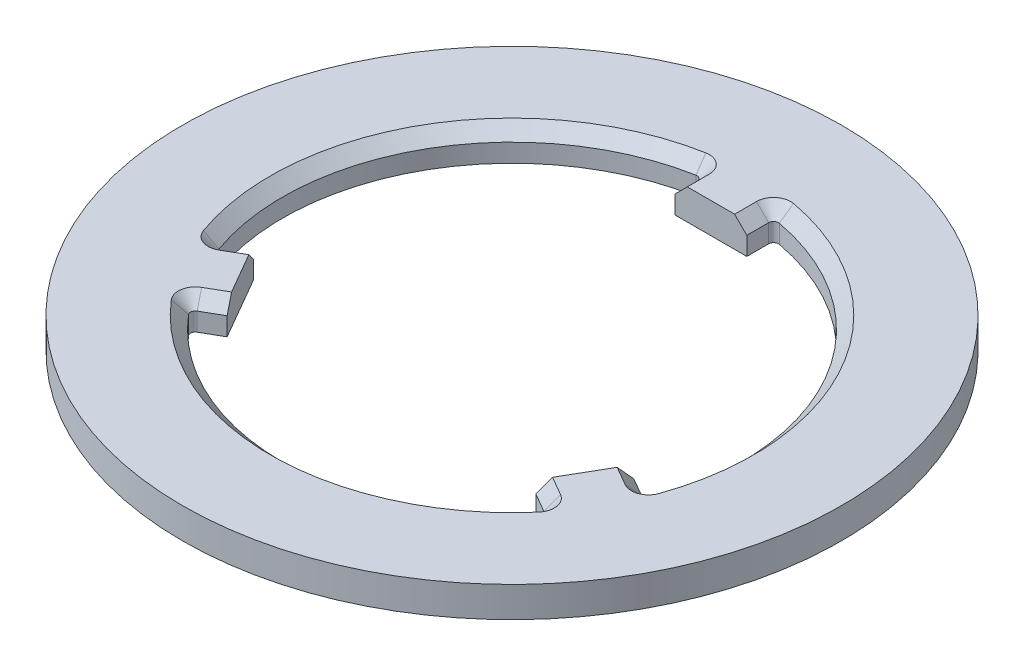
ISO-10303-21;
HEADER;
FILE_DESCRIPTION(('STEP AP214'),'2;1');
FILE_NAME('part.step','',(''),(''),'','','');
FILE_SCHEMA(('AUTOMOTIVE_DESIGN { 1 0 10303 214 1 1 1 1 }'));
ENDSEC;
DATA;
#1=APPLICATION_CONTEXT('core data for automotive mechanical design processes');
#2=APPLICATION_PROTOCOL_DEFINITION('international standard','automotive_design',2000,#1);
#3=PRODUCT_CONTEXT('',#1,'mechanical');
#4=PRODUCT('Part','Part','',(#3));
#5=PRODUCT_RELATED_PRODUCT_CATEGORY('part','',(#4));
#6=PRODUCT_DEFINITION_FORMATION('','',#4);
#7=PRODUCT_DEFINITION_CONTEXT('part definition',#1,'design');
#8=PRODUCT_DEFINITION('design','',#6,#7);
#9=PRODUCT_DEFINITION_SHAPE('','',#8);
#10=(LENGTH_UNIT() NAMED_UNIT(*) SI_UNIT(.MILLI.,.METRE.));
#11=(NAMED_UNIT(*) PLANE_ANGLE_UNIT() SI_UNIT($,.RADIAN.));
#12=(NAMED_UNIT(*) SI_UNIT($,.STERADIAN.) SOLID_ANGLE_UNIT());
#13=UNCERTAINTY_MEASURE_WITH_UNIT(LENGTH_MEASURE(1.E-05),#10,'distance_accuracy_value','');
#14=(GEOMETRIC_REPRESENTATION_CONTEXT(3) GLOBAL_UNCERTAINTY_ASSIGNED_CONTEXT((#13)) GLOBAL_UNIT_ASSIGNED_CONTEXT((#10,
#11,#12)) REPRESENTATION_CONTEXT('',''));
#15=CARTESIAN_POINT('',(0.,0.,0.));
#16=DIRECTION('',(0.,0.,1.));
#17=DIRECTION('',(1.,0.,0.));
#18=AXIS2_PLACEMENT_3D('',#15,#16,#17);
#19=CARTESIAN_POINT('',(0.,2.5,0.));
#20=DIRECTION('',(0.,-1.,0.));
#21=DIRECTION('',(0.,0.,-1.));
#22=AXIS2_PLACEMENT_3D('',#19,#20,#21);
#23=CYLINDRICAL_SURFACE('',#22,37.6);
#24=DIRECTION('',(0.,-1.,0.));
#25=VECTOR('',#24,1.);
#26=CARTESIAN_POINT('',(-28.6123532448992,2.5,24.3945330307654));
#27=LINE('',#26,#25);
#28=CARTESIAN_POINT('',(-28.6123532448992,-2.5,24.3945330307654));
#29=VERTEX_POINT('',#28);
#30=CARTESIAN_POINT('',(-28.6123532448992,0.499999999999984,24.3945330307654));
#31=VERTEX_POINT('',#30);
#32=EDGE_CURVE('E327',#29,#31,#27,.F.);
#33=ORIENTED_EDGE('',*,*,#32,.T.);
#34=CARTESIAN_POINT('',(0.,0.499999999999984,0.));
#35=DIRECTION('',(0.,1.,0.));
#36=DIRECTION('',(0.,0.,1.));
#37=AXIS2_PLACEMENT_3D('',#34,#35,#36);
#38=CIRCLE('',#37,37.6);
#39=CARTESIAN_POINT('',(28.6123532448989,0.499999999999984,24.3945330307658));
#40=VERTEX_POINT('',#39);
#41=EDGE_CURVE('E382',#31,#40,#38,.T.);
#42=ORIENTED_EDGE('',*,*,#41,.T.);
#43=DIRECTION('',(0.,-1.,0.));
#44=VECTOR('',#43,1.);
#45=CARTESIAN_POINT('',(28.6123532448989,2.5,24.3945330307658));
#46=LINE('',#45,#44);
#47=CARTESIAN_POINT('',(28.6123532448989,-2.5,24.3945330307658));
#48=VERTEX_POINT('',#47);
#49=EDGE_CURVE('E308',#40,#48,#46,.T.);
#50=ORIENTED_EDGE('',*,*,#49,.T.);
#51=CARTESIAN_POINT('',(0.,-2.5,0.));
#52=DIRECTION('',(0.,1.,0.));
#53=DIRECTION('',(0.,0.,1.));
#54=AXIS2_PLACEMENT_3D('',#51,#52,#53);
#55=CIRCLE('',#54,37.6);
#56=EDGE_CURVE('E288',#29,#48,#55,.T.);
#57=ORIENTED_EDGE('',*,*,#56,.F.);
#58=EDGE_LOOP('',(#33,#42,#50,#57));
#59=FACE_BOUND('',#58,.T.);
#60=ADVANCED_FACE('F37',(#59),#23,.F.);
#61=DIRECTION('',(0.,-1.,0.));
#62=VECTOR('',#61,1.);
#63=CARTESIAN_POINT('',(-6.82010869565217,2.5,-36.9762912875195));
#64=LINE('',#63,#62);
#65=CARTESIAN_POINT('',(-6.82010869565217,-2.5,-36.9762912875195));
#66=VERTEX_POINT('',#65);
#67=CARTESIAN_POINT('',(-6.82010869565217,0.500000000000047,-36.9762912875195));
#68=VERTEX_POINT('',#67);
#69=EDGE_CURVE('E292',#66,#68,#64,.F.);
#70=ORIENTED_EDGE('',*,*,#69,.T.);
#71=CARTESIAN_POINT('',(0.,0.500000000000047,0.));
#72=DIRECTION('',(0.,1.,0.));
#73=DIRECTION('',(0.,0.,1.));
#74=AXIS2_PLACEMENT_3D('',#71,#72,#73);
#75=CIRCLE('',#74,37.6);
#76=CARTESIAN_POINT('',(-35.4324619405513,0.500000000000047,12.5817582567535));
#77=VERTEX_POINT('',#76);
#78=EDGE_CURVE('E396',#68,#77,#75,.T.);
#79=ORIENTED_EDGE('',*,*,#78,.T.);
#80=DIRECTION('',(0.,-1.,0.));
#81=VECTOR('',#80,1.);
#82=CARTESIAN_POINT('',(-35.4324619405513,2.5,12.5817582567535));
#83=LINE('',#82,#81);
#84=CARTESIAN_POINT('',(-35.4324619405513,-2.5,12.5817582567535));
#85=VERTEX_POINT('',#84);
#86=EDGE_CURVE('E321',#77,#85,#83,.T.);
#87=ORIENTED_EDGE('',*,*,#86,.T.);
#88=EDGE_CURVE('E284',#66,#85,#55,.T.);
#89=ORIENTED_EDGE('',*,*,#88,.F.);
#90=EDGE_LOOP('',(#70,#79,#87,#89));
#91=FACE_BOUND('',#90,.T.);
#92=ADVANCED_FACE('F529',(#91),#23,.F.);
#93=DIRECTION('',(0.,-1.,0.));
#94=VECTOR('',#93,1.);
#95=CARTESIAN_POINT('',(35.4324619405511,2.5,12.581758256754));
#96=LINE('',#95,#94);
#97=CARTESIAN_POINT('',(35.4324619405511,-2.5,12.581758256754));
#98=VERTEX_POINT('',#97);
#99=CARTESIAN_POINT('',(35.4324619405511,0.50000000000004,12.581758256754));
#100=VERTEX_POINT('',#99);
#101=EDGE_CURVE('E315',#98,#100,#96,.F.);
#102=ORIENTED_EDGE('',*,*,#101,.T.);
#103=CARTESIAN_POINT('',(0.,0.50000000000004,0.));
#104=DIRECTION('',(0.,1.,0.));
#105=DIRECTION('',(0.,0.,1.));
#106=AXIS2_PLACEMENT_3D('',#103,#104,#105);
#107=CIRCLE('',#106,37.6);
#108=CARTESIAN_POINT('',(6.82010869565217,0.50000000000004,-36.9762912875195));
#109=VERTEX_POINT('',#108);
#110=EDGE_CURVE('E11',#100,#109,#107,.T.);
#111=ORIENTED_EDGE('',*,*,#110,.T.);
#112=DIRECTION('',(0.,-1.,0.));
#113=VECTOR('',#112,1.);
#114=CARTESIAN_POINT('',(6.82010869565217,2.5,-36.9762912875195));
#115=LINE('',#114,#113);
#116=CARTESIAN_POINT('',(6.82010869565217,-2.5,-36.9762912875195));
#117=VERTEX_POINT('',#116);
#118=EDGE_CURVE('E297',#109,#117,#115,.T.);
#119=ORIENTED_EDGE('',*,*,#118,.T.);
#120=EDGE_CURVE('E283',#98,#117,#55,.T.);
#121=ORIENTED_EDGE('',*,*,#120,.F.);
#122=EDGE_LOOP('',(#102,#111,#119,#121));
#123=FACE_BOUND('',#122,.T.);
#124=ADVANCED_FACE('F462',(#123),#23,.F.);
#125=CARTESIAN_POINT('',(0.,2.5,0.));
#126=DIRECTION('',(0.,1.,0.));
#127=DIRECTION('',(0.,0.,1.));
#128=AXIS2_PLACEMENT_3D('',#125,#126,#127);
#129=PLANE('',#128);
#130=CARTESIAN_POINT('',(0.,2.5,0.));
#131=DIRECTION('',(0.,1.,0.));
#132=DIRECTION('',(0.,0.,1.));
#133=AXIS2_PLACEMENT_3D('',#130,#131,#132);
#134=CIRCLE('',#133,54.);
#135=CARTESIAN_POINT('',(0.,2.5,54.));
#136=VERTEX_POINT('',#135);
#137=EDGE_CURVE('E289',#136,#136,#134,.T.);
#138=ORIENTED_EDGE('',*,*,#137,.T.);
#139=EDGE_LOOP('',(#138));
#140=FACE_BOUND('',#139,.T.);
#141=CARTESIAN_POINT('',(-28.0035797716035,2.5,23.8755004130896));
#142=DIRECTION('',(0.,1.,0.));
#143=DIRECTION('',(0.,0.,1.));
#144=AXIS2_PLACEMENT_3D('',#141,#142,#143);
#145=CIRCLE('',#144,2.80000000000002);
#146=CARTESIAN_POINT('',(-30.1342869281386,2.5,25.6921145749551));
#147=VERTEX_POINT('',#146);
#148=CARTESIAN_POINT('',(-29.4035797716035,2.5,21.4506292824931));
#149=VERTEX_POINT('',#148);
#150=EDGE_CURVE('E360',#147,#149,#145,.F.);
#151=ORIENTED_EDGE('',*,*,#150,.T.);
#152=DIRECTION('',(0.866025403784443,0.,-0.499999999999992));
#153=VECTOR('',#152,1.);
#154=CARTESIAN_POINT('',(-26.2949281633729,2.5,19.6558484396644));
#155=LINE('',#154,#153);
#156=CARTESIAN_POINT('',(-26.2949281633729,2.5,19.6558484396644));
#157=VERTEX_POINT('',#156);
#158=EDGE_CURVE('E364',#149,#157,#155,.T.);
#159=ORIENTED_EDGE('',*,*,#158,.T.);
#160=DIRECTION('',(-0.499999999999992,0.,-0.866025403784443));
#161=VECTOR('',#160,1.);
#162=CARTESIAN_POINT('',(-25.2949281633729,2.5,21.3878992472333));
#163=LINE('',#162,#161);
#164=CARTESIAN_POINT('',(-30.1699281633728,2.5,12.944151560335));
#165=VERTEX_POINT('',#164);
#166=EDGE_CURVE('E247',#157,#165,#163,.T.);
#167=ORIENTED_EDGE('',*,*,#166,.T.);
#168=DIRECTION('',(-0.866025403784443,0.,0.499999999999992));
#169=VECTOR('',#168,1.);
#170=CARTESIAN_POINT('',(-33.2785797716034,2.5,14.7389324031636));
#171=LINE('',#170,#169);
#172=CARTESIAN_POINT('',(-33.2785797716034,2.5,14.7389324031636));
#173=VERTEX_POINT('',#172);
#174=EDGE_CURVE('E351',#165,#173,#171,.T.);
#175=ORIENTED_EDGE('',*,*,#174,.T.);
#176=CARTESIAN_POINT('',(-34.6785797716034,2.5,12.3140612725672));
#177=DIRECTION('',(0.,1.,0.));
#178=DIRECTION('',(0.,0.,1.));
#179=AXIS2_PLACEMENT_3D('',#176,#177,#178);
#180=CIRCLE('',#179,2.79999999999996);
#181=CARTESIAN_POINT('',(-37.317167362921,2.5,13.2510007172191));
#182=VERTEX_POINT('',#181);
#183=EDGE_CURVE('E347',#173,#182,#180,.F.);
#184=ORIENTED_EDGE('',*,*,#183,.T.);
#185=CARTESIAN_POINT('',(0.,2.5,0.));
#186=DIRECTION('',(0.,1.,0.));
#187=DIRECTION('',(0.,0.,1.));
#188=AXIS2_PLACEMENT_3D('',#185,#186,#187);
#189=CIRCLE('',#188,39.6);
#190=CARTESIAN_POINT('',(-7.1828804347826,2.5,-38.9431152921747));
#191=VERTEX_POINT('',#190);
#192=EDGE_CURVE('E345',#182,#191,#189,.F.);
#193=ORIENTED_EDGE('',*,*,#192,.T.);
#194=CARTESIAN_POINT('',(-6.675,2.5,-36.1895616856574));
#195=DIRECTION('',(0.,1.,0.));
#196=DIRECTION('',(0.,0.,1.));
#197=AXIS2_PLACEMENT_3D('',#194,#195,#196);
#198=CIRCLE('',#197,2.79999999999996);
#199=CARTESIAN_POINT('',(-3.87500000000004,2.5,-36.1895616856574));
#200=VERTEX_POINT('',#199);
#201=EDGE_CURVE('E349',#191,#200,#198,.F.);
#202=ORIENTED_EDGE('',*,*,#201,.T.);
#203=DIRECTION('',(0.,0.,1.));
#204=VECTOR('',#203,1.);
#205=CARTESIAN_POINT('',(-3.87500000000004,2.5,-32.6));
#206=LINE('',#205,#204);
#207=CARTESIAN_POINT('',(-3.87500000000004,2.5,-32.6));
#208=VERTEX_POINT('',#207);
#209=EDGE_CURVE('E353',#200,#208,#206,.T.);
#210=ORIENTED_EDGE('',*,*,#209,.T.);
#211=DIRECTION('',(1.,0.,0.));
#212=VECTOR('',#211,1.);
#213=CARTESIAN_POINT('',(-5.875,2.5,-32.6));
#214=LINE('',#213,#212);
#215=CARTESIAN_POINT('',(3.87500000000003,2.5,-32.6));
#216=VERTEX_POINT('',#215);
#217=EDGE_CURVE('E268',#208,#216,#214,.T.);
#218=ORIENTED_EDGE('',*,*,#217,.T.);
#219=DIRECTION('',(0.,0.,-1.));
#220=VECTOR('',#219,1.);
#221=CARTESIAN_POINT('',(3.87500000000003,2.5,-36.1895616856574));
#222=LINE('',#221,#220);
#223=CARTESIAN_POINT('',(3.87500000000003,2.5,-36.1895616856574));
#224=VERTEX_POINT('',#223);
#225=EDGE_CURVE('E340',#216,#224,#222,.T.);
#226=ORIENTED_EDGE('',*,*,#225,.T.);
#227=CARTESIAN_POINT('',(6.675,2.5,-36.1895616856574));
#228=DIRECTION('',(0.,1.,0.));
#229=DIRECTION('',(0.,0.,1.));
#230=AXIS2_PLACEMENT_3D('',#227,#228,#229);
#231=CIRCLE('',#230,2.79999999999997);
#232=CARTESIAN_POINT('',(7.1828804347826,2.5,-38.9431152921748));
#233=VERTEX_POINT('',#232);
#234=EDGE_CURVE('E336',#224,#233,#231,.F.);
#235=ORIENTED_EDGE('',*,*,#234,.T.);
#236=CARTESIAN_POINT('',(0.,2.5,0.));
#237=DIRECTION('',(0.,1.,0.));
#238=DIRECTION('',(0.,0.,1.));
#239=AXIS2_PLACEMENT_3D('',#236,#237,#238);
#240=CIRCLE('',#239,39.6);
#241=CARTESIAN_POINT('',(37.3171673629208,2.5,13.2510007172196));
#242=VERTEX_POINT('',#241);
#243=EDGE_CURVE('E334',#233,#242,#240,.F.);
#244=ORIENTED_EDGE('',*,*,#243,.T.);
#245=CARTESIAN_POINT('',(34.6785797716032,2.5,12.3140612725677));
#246=DIRECTION('',(0.,1.,0.));
#247=DIRECTION('',(0.,0.,1.));
#248=AXIS2_PLACEMENT_3D('',#245,#246,#247);
#249=CIRCLE('',#248,2.79999999999997);
#250=CARTESIAN_POINT('',(33.2785797716032,2.5,14.7389324031641));
#251=VERTEX_POINT('',#250);
#252=EDGE_CURVE('E338',#242,#251,#249,.F.);
#253=ORIENTED_EDGE('',*,*,#252,.T.);
#254=DIRECTION('',(-0.866025403784436,0.,-0.500000000000004));
#255=VECTOR('',#254,1.);
#256=CARTESIAN_POINT('',(30.1699281633726,2.5,12.9441515603354));
#257=LINE('',#256,#255);
#258=CARTESIAN_POINT('',(30.1699281633726,2.5,12.9441515603354));
#259=VERTEX_POINT('',#258);
#260=EDGE_CURVE('E342',#251,#259,#257,.T.);
#261=ORIENTED_EDGE('',*,*,#260,.T.);
#262=DIRECTION('',(-0.500000000000004,0.,0.866025403784436));
#263=VECTOR('',#262,1.);
#264=CARTESIAN_POINT('',(31.1699281633726,2.5,11.2121007527666));
#265=LINE('',#264,#263);
#266=CARTESIAN_POINT('',(26.2949281633726,2.5,19.6558484396648));
#267=VERTEX_POINT('',#266);
#268=EDGE_CURVE('E252',#259,#267,#265,.T.);
#269=ORIENTED_EDGE('',*,*,#268,.T.);
#270=DIRECTION('',(0.866025403784437,0.,0.500000000000004));
#271=VECTOR('',#270,1.);
#272=CARTESIAN_POINT('',(29.4035797716032,2.5,21.4506292824935));
#273=LINE('',#272,#271);
#274=CARTESIAN_POINT('',(29.4035797716032,2.5,21.4506292824935));
#275=VERTEX_POINT('',#274);
#276=EDGE_CURVE('E362',#267,#275,#273,.T.);
#277=ORIENTED_EDGE('',*,*,#276,.T.);
#278=CARTESIAN_POINT('',(28.0035797716032,2.5,23.8755004130899));
#279=DIRECTION('',(0.,1.,0.));
#280=DIRECTION('',(0.,0.,1.));
#281=AXIS2_PLACEMENT_3D('',#278,#279,#280);
#282=CIRCLE('',#281,2.80000000000002);
#283=CARTESIAN_POINT('',(30.1342869281382,2.5,25.6921145749555));
#284=VERTEX_POINT('',#283);
#285=EDGE_CURVE('E358',#275,#284,#282,.F.);
#286=ORIENTED_EDGE('',*,*,#285,.T.);
#287=CARTESIAN_POINT('',(0.,2.5,0.));
#288=DIRECTION('',(0.,1.,0.));
#289=DIRECTION('',(0.,0.,1.));
#290=AXIS2_PLACEMENT_3D('',#287,#288,#289);
#291=CIRCLE('',#290,39.6);
#292=EDGE_CURVE('E356',#284,#147,#291,.F.);
#293=ORIENTED_EDGE('',*,*,#292,.T.);
#294=EDGE_LOOP('',(#151,#159,#167,#175,#184,#193,#202,#210,#218,#226,#235,#244,#253,#261,#269,
#277,#286,#293));
#295=FACE_BOUND('',#294,.T.);
#296=ADVANCED_FACE('F491',(#140,#295),#129,.T.);
#297=CARTESIAN_POINT('',(0.,-2.5,0.));
#298=DIRECTION('',(0.,1.,0.));
#299=DIRECTION('',(0.,0.,1.));
#300=AXIS2_PLACEMENT_3D('',#297,#298,#299);
#301=PLANE('',#300);
#302=CARTESIAN_POINT('',(0.,-2.5,0.));
#303=DIRECTION('',(0.,1.,0.));
#304=DIRECTION('',(0.,0.,1.));
#305=AXIS2_PLACEMENT_3D('',#302,#303,#304);
#306=CIRCLE('',#305,54.);
#307=CARTESIAN_POINT('',(0.,-2.5,54.));
#308=VERTEX_POINT('',#307);
#309=EDGE_CURVE('E287',#308,#308,#306,.T.);
#310=ORIENTED_EDGE('',*,*,#309,.F.);
#311=EDGE_LOOP('',(#310));
#312=FACE_BOUND('',#311,.T.);
#313=DIRECTION('',(0.,0.,1.));
#314=VECTOR('',#313,1.);
#315=CARTESIAN_POINT('',(-5.875,-2.5,-32.6));
#316=LINE('',#315,#314);
#317=CARTESIAN_POINT('',(-5.875,-2.5,-36.1895616856574));
#318=VERTEX_POINT('',#317);
#319=CARTESIAN_POINT('',(-5.875,-2.5,-32.6));
#320=VERTEX_POINT('',#319);
#321=EDGE_CURVE('E267',#318,#320,#316,.T.);
#322=ORIENTED_EDGE('',*,*,#321,.F.);
#323=CARTESIAN_POINT('',(-6.675,-2.5,-36.1895616856574));
#324=DIRECTION('',(0.,1.,0.));
#325=DIRECTION('',(0.,0.,1.));
#326=AXIS2_PLACEMENT_3D('',#323,#324,#325);
#327=CIRCLE('',#326,0.8);
#328=EDGE_CURVE('E306',#318,#66,#327,.T.);
#329=ORIENTED_EDGE('',*,*,#328,.T.);
#330=ORIENTED_EDGE('',*,*,#88,.T.);
#331=CARTESIAN_POINT('',(-34.6785797716034,-2.5,12.3140612725672));
#332=DIRECTION('',(0.,1.,0.));
#333=DIRECTION('',(0.,0.,1.));
#334=AXIS2_PLACEMENT_3D('',#331,#332,#333);
#335=CIRCLE('',#334,0.8);
#336=CARTESIAN_POINT('',(-34.2785797716034,-2.5,13.0068815955948));
#337=VERTEX_POINT('',#336);
#338=EDGE_CURVE('E330',#85,#337,#335,.T.);
#339=ORIENTED_EDGE('',*,*,#338,.T.);
#340=DIRECTION('',(-0.866025403784443,0.,0.499999999999992));
#341=VECTOR('',#340,1.);
#342=CARTESIAN_POINT('',(-31.1699281633728,-2.5,11.2121007527661));
#343=LINE('',#342,#341);
#344=CARTESIAN_POINT('',(-31.1699281633728,-2.5,11.2121007527661));
#345=VERTEX_POINT('',#344);
#346=EDGE_CURVE('E245',#345,#337,#343,.T.);
#347=ORIENTED_EDGE('',*,*,#346,.F.);
#348=DIRECTION('',(-0.499999999999992,0.,-0.866025403784443));
#349=VECTOR('',#348,1.);
#350=CARTESIAN_POINT('',(-25.2949281633729,-2.5,21.3878992472333));
#351=LINE('',#350,#349);
#352=CARTESIAN_POINT('',(-25.2949281633729,-2.5,21.3878992472333));
#353=VERTEX_POINT('',#352);
#354=EDGE_CURVE('E225',#353,#345,#351,.T.);
#355=ORIENTED_EDGE('',*,*,#354,.F.);
#356=DIRECTION('',(0.866025403784443,0.,-0.499999999999992));
#357=VECTOR('',#356,1.);
#358=CARTESIAN_POINT('',(-25.2949281633729,-2.5,21.3878992472333));
#359=LINE('',#358,#357);
#360=CARTESIAN_POINT('',(-28.4035797716035,-2.5,23.182680090062));
#361=VERTEX_POINT('',#360);
#362=EDGE_CURVE('E234',#361,#353,#359,.T.);
#363=ORIENTED_EDGE('',*,*,#362,.F.);
#364=CARTESIAN_POINT('',(-28.0035797716035,-2.5,23.8755004130896));
#365=DIRECTION('',(0.,1.,0.));
#366=DIRECTION('',(0.,0.,1.));
#367=AXIS2_PLACEMENT_3D('',#364,#365,#366);
#368=CIRCLE('',#367,0.8);
#369=EDGE_CURVE('E332',#361,#29,#368,.T.);
#370=ORIENTED_EDGE('',*,*,#369,.T.);
#371=ORIENTED_EDGE('',*,*,#56,.T.);
#372=CARTESIAN_POINT('',(28.0035797716032,-2.5,23.8755004130899));
#373=DIRECTION('',(0.,1.,0.));
#374=DIRECTION('',(0.,0.,1.));
#375=AXIS2_PLACEMENT_3D('',#372,#373,#374);
#376=CIRCLE('',#375,0.8);
#377=CARTESIAN_POINT('',(28.4035797716032,-2.5,23.1826800900624));
#378=VERTEX_POINT('',#377);
#379=EDGE_CURVE('E317',#48,#378,#376,.T.);
#380=ORIENTED_EDGE('',*,*,#379,.T.);
#381=DIRECTION('',(0.866025403784436,0.,0.500000000000004));
#382=VECTOR('',#381,1.);
#383=CARTESIAN_POINT('',(25.2949281633726,-2.5,21.3878992472337));
#384=LINE('',#383,#382);
#385=CARTESIAN_POINT('',(25.2949281633726,-2.5,21.3878992472337));
#386=VERTEX_POINT('',#385);
#387=EDGE_CURVE('E256',#386,#378,#384,.T.);
#388=ORIENTED_EDGE('',*,*,#387,.F.);
#389=DIRECTION('',(-0.500000000000004,0.,0.866025403784436));
#390=VECTOR('',#389,1.);
#391=CARTESIAN_POINT('',(31.1699281633726,-2.5,11.2121007527666));
#392=LINE('',#391,#390);
#393=CARTESIAN_POINT('',(31.1699281633726,-2.5,11.2121007527666));
#394=VERTEX_POINT('',#393);
#395=EDGE_CURVE('E259',#394,#386,#392,.T.);
#396=ORIENTED_EDGE('',*,*,#395,.F.);
#397=DIRECTION('',(-0.866025403784436,0.,-0.500000000000004));
#398=VECTOR('',#397,1.);
#399=CARTESIAN_POINT('',(31.1699281633726,-2.5,11.2121007527666));
#400=LINE('',#399,#398);
#401=CARTESIAN_POINT('',(34.2785797716032,-2.5,13.0068815955953));
#402=VERTEX_POINT('',#401);
#403=EDGE_CURVE('E230',#402,#394,#400,.T.);
#404=ORIENTED_EDGE('',*,*,#403,.F.);
#405=CARTESIAN_POINT('',(34.6785797716032,-2.5,12.3140612725677));
#406=DIRECTION('',(0.,1.,0.));
#407=DIRECTION('',(0.,0.,1.));
#408=AXIS2_PLACEMENT_3D('',#405,#406,#407);
#409=CIRCLE('',#408,0.8);
#410=EDGE_CURVE('E319',#402,#98,#409,.T.);
#411=ORIENTED_EDGE('',*,*,#410,.T.);
#412=ORIENTED_EDGE('',*,*,#120,.T.);
#413=CARTESIAN_POINT('',(6.675,-2.5,-36.1895616856574));
#414=DIRECTION('',(0.,1.,0.));
#415=DIRECTION('',(0.,0.,1.));
#416=AXIS2_PLACEMENT_3D('',#413,#414,#415);
#417=CIRCLE('',#416,0.8);
#418=CARTESIAN_POINT('',(5.875,-2.5,-36.1895616856574));
#419=VERTEX_POINT('',#418);
#420=EDGE_CURVE('E304',#117,#419,#417,.T.);
#421=ORIENTED_EDGE('',*,*,#420,.T.);
#422=DIRECTION('',(0.,0.,-1.));
#423=VECTOR('',#422,1.);
#424=CARTESIAN_POINT('',(5.875,-2.5,-32.6));
#425=LINE('',#424,#423);
#426=CARTESIAN_POINT('',(5.875,-2.5,-32.6));
#427=VERTEX_POINT('',#426);
#428=EDGE_CURVE('E272',#427,#419,#425,.T.);
#429=ORIENTED_EDGE('',*,*,#428,.F.);
#430=DIRECTION('',(1.,0.,0.));
#431=VECTOR('',#430,1.);
#432=CARTESIAN_POINT('',(-5.875,-2.5,-32.6));
#433=LINE('',#432,#431);
#434=EDGE_CURVE('E275',#320,#427,#433,.T.);
#435=ORIENTED_EDGE('',*,*,#434,.F.);
#436=EDGE_LOOP('',(#322,#329,#330,#339,#347,#355,#363,#370,#371,#380,#388,#396,#404,#411,#412,
#421,#429,#435));
#437=FACE_BOUND('',#436,.T.);
#438=ADVANCED_FACE('F243',(#312,#437),#301,.F.);
#439=CARTESIAN_POINT('',(0.,2.5,0.));
#440=DIRECTION('',(0.,-1.,0.));
#441=DIRECTION('',(0.,0.,-1.));
#442=AXIS2_PLACEMENT_3D('',#439,#440,#441);
#443=CYLINDRICAL_SURFACE('',#442,54.);
#444=ORIENTED_EDGE('',*,*,#137,.F.);
#445=EDGE_LOOP('',(#444));
#446=FACE_BOUND('',#445,.T.);
#447=ORIENTED_EDGE('',*,*,#309,.T.);
#448=EDGE_LOOP('',(#447));
#449=FACE_BOUND('',#448,.T.);
#450=ADVANCED_FACE('F580',(#446,#449),#443,.T.);
#451=CARTESIAN_POINT('',(-5.875,2.5,-32.6));
#452=DIRECTION('',(1.,0.,0.));
#453=DIRECTION('',(0.,0.,-1.));
#454=AXIS2_PLACEMENT_3D('',#451,#452,#453);
#455=PLANE('',#454);
#456=DIRECTION('',(0.,-1.,0.));
#457=VECTOR('',#456,1.);
#458=CARTESIAN_POINT('',(-5.875,2.5,-32.6));
#459=LINE('',#458,#457);
#460=CARTESIAN_POINT('',(-5.875,0.500000000000047,-32.6));
#461=VERTEX_POINT('',#460);
#462=EDGE_CURVE('E281',#461,#320,#459,.T.);
#463=ORIENTED_EDGE('',*,*,#462,.F.);
#464=DIRECTION('',(0.,0.,-1.));
#465=VECTOR('',#464,1.);
#466=CARTESIAN_POINT('',(-5.875,0.500000000000047,-36.1895616856574));
#467=LINE('',#466,#465);
#468=CARTESIAN_POINT('',(-5.875,0.500000000000047,-36.1895616856574));
#469=VERTEX_POINT('',#468);
#470=EDGE_CURVE('E388',#461,#469,#467,.T.);
#471=ORIENTED_EDGE('',*,*,#470,.T.);
#472=DIRECTION('',(0.,-1.,0.));
#473=VECTOR('',#472,1.);
#474=CARTESIAN_POINT('',(-5.875,2.5,-36.1895616856574));
#475=LINE('',#474,#473);
#476=EDGE_CURVE('E302',#469,#318,#475,.T.);
#477=ORIENTED_EDGE('',*,*,#476,.T.);
#478=ORIENTED_EDGE('',*,*,#321,.T.);
#479=EDGE_LOOP('',(#463,#471,#477,#478));
#480=FACE_BOUND('',#479,.T.);
#481=ADVANCED_FACE('F513',(#480),#455,.F.);
#482=CARTESIAN_POINT('',(-5.875,2.5,-32.6));
#483=DIRECTION('',(0.,0.,-1.));
#484=DIRECTION('',(-1.,0.,0.));
#485=AXIS2_PLACEMENT_3D('',#482,#483,#484);
#486=PLANE('',#485);
#487=ORIENTED_EDGE('',*,*,#217,.F.);
#488=DIRECTION('',(-0.707106781186549,-0.707106781186547,0.));
#489=VECTOR('',#488,1.);
#490=CARTESIAN_POINT('',(-3.87500000000004,2.5,-32.6));
#491=LINE('',#490,#489);
#492=EDGE_CURVE('E386',#208,#461,#491,.T.);
#493=ORIENTED_EDGE('',*,*,#492,.T.);
#494=ORIENTED_EDGE('',*,*,#462,.T.);
#495=ORIENTED_EDGE('',*,*,#434,.T.);
#496=DIRECTION('',(0.,-1.,0.));
#497=VECTOR('',#496,1.);
#498=CARTESIAN_POINT('',(5.875,2.5,-32.6));
#499=LINE('',#498,#497);
#500=CARTESIAN_POINT('',(5.875,0.50000000000004,-32.6));
#501=VERTEX_POINT('',#500);
#502=EDGE_CURVE('E271',#501,#427,#499,.T.);
#503=ORIENTED_EDGE('',*,*,#502,.F.);
#504=DIRECTION('',(-0.707106781186549,0.707106781186546,0.));
#505=VECTOR('',#504,1.);
#506=CARTESIAN_POINT('',(3.87500000000003,2.5,-32.6));
#507=LINE('',#506,#505);
#508=EDGE_CURVE('E384',#501,#216,#507,.T.);
#509=ORIENTED_EDGE('',*,*,#508,.T.);
#510=EDGE_LOOP('',(#487,#493,#494,#495,#503,#509));
#511=FACE_BOUND('',#510,.T.);
#512=ADVANCED_FACE('F453',(#511),#486,.F.);
#513=CARTESIAN_POINT('',(5.875,2.5,-32.6));
#514=DIRECTION('',(-1.,0.,0.));
#515=DIRECTION('',(0.,0.,1.));
#516=AXIS2_PLACEMENT_3D('',#513,#514,#515);
#517=PLANE('',#516);
#518=DIRECTION('',(0.,-1.,0.));
#519=VECTOR('',#518,1.);
#520=CARTESIAN_POINT('',(5.875,2.5,-36.1895616856574));
#521=LINE('',#520,#519);
#522=CARTESIAN_POINT('',(5.875,0.50000000000004,-36.1895616856574));
#523=VERTEX_POINT('',#522);
#524=EDGE_CURVE('E299',#419,#523,#521,.F.);
#525=ORIENTED_EDGE('',*,*,#524,.T.);
#526=DIRECTION('',(0.,0.,1.));
#527=VECTOR('',#526,1.);
#528=CARTESIAN_POINT('',(5.875,0.50000000000004,-32.6));
#529=LINE('',#528,#527);
#530=EDGE_CURVE('E400',#523,#501,#529,.T.);
#531=ORIENTED_EDGE('',*,*,#530,.T.);
#532=ORIENTED_EDGE('',*,*,#502,.T.);
#533=ORIENTED_EDGE('',*,*,#428,.T.);
#534=EDGE_LOOP('',(#525,#531,#532,#533));
#535=FACE_BOUND('',#534,.T.);
#536=ADVANCED_FACE('F449',(#535),#517,.F.);
#537=CARTESIAN_POINT('',(6.675,2.5,-36.1895616856574));
#538=DIRECTION('',(0.,-1.,0.));
#539=DIRECTION('',(0.,0.,-1.));
#540=AXIS2_PLACEMENT_3D('',#537,#538,#539);
#541=CYLINDRICAL_SURFACE('',#540,0.8);
#542=ORIENTED_EDGE('',*,*,#118,.F.);
#543=CARTESIAN_POINT('',(6.675,0.50000000000004,-36.1895616856574));
#544=DIRECTION('',(0.,1.,0.));
#545=DIRECTION('',(0.,0.,1.));
#546=AXIS2_PLACEMENT_3D('',#543,#544,#545);
#547=CIRCLE('',#546,0.8);
#548=EDGE_CURVE('E47',#109,#523,#547,.T.);
#549=ORIENTED_EDGE('',*,*,#548,.T.);
#550=ORIENTED_EDGE('',*,*,#524,.F.);
#551=ORIENTED_EDGE('',*,*,#420,.F.);
#552=EDGE_LOOP('',(#542,#549,#550,#551));
#553=FACE_BOUND('',#552,.T.);
#554=ADVANCED_FACE('F460',(#553),#541,.F.);
#555=CARTESIAN_POINT('',(-6.675,2.5,-36.1895616856574));
#556=DIRECTION('',(0.,-1.,0.));
#557=DIRECTION('',(0.,0.,-1.));
#558=AXIS2_PLACEMENT_3D('',#555,#556,#557);
#559=CYLINDRICAL_SURFACE('',#558,0.8);
#560=ORIENTED_EDGE('',*,*,#476,.F.);
#561=CARTESIAN_POINT('',(-6.675,0.500000000000047,-36.1895616856574));
#562=DIRECTION('',(0.,1.,0.));
#563=DIRECTION('',(0.,0.,1.));
#564=AXIS2_PLACEMENT_3D('',#561,#562,#563);
#565=CIRCLE('',#564,0.8);
#566=EDGE_CURVE('E392',#469,#68,#565,.T.);
#567=ORIENTED_EDGE('',*,*,#566,.T.);
#568=ORIENTED_EDGE('',*,*,#69,.F.);
#569=ORIENTED_EDGE('',*,*,#328,.F.);
#570=EDGE_LOOP('',(#560,#567,#568,#569));
#571=FACE_BOUND('',#570,.T.);
#572=ADVANCED_FACE('F524',(#571),#559,.F.);
#573=CARTESIAN_POINT('',(31.1699281633726,2.5,11.2121007527666));
#574=DIRECTION('',(-0.500000000000004,0.,0.866025403784436));
#575=DIRECTION('',(0.866025403784436,0.,0.500000000000004));
#576=AXIS2_PLACEMENT_3D('',#573,#574,#575);
#577=PLANE('',#576);
#578=DIRECTION('',(0.,-1.,0.));
#579=VECTOR('',#578,1.);
#580=CARTESIAN_POINT('',(31.1699281633726,2.5,11.2121007527666));
#581=LINE('',#580,#579);
#582=CARTESIAN_POINT('',(31.1699281633726,0.500000000000036,11.2121007527666));
#583=VERTEX_POINT('',#582);
#584=EDGE_CURVE('E265',#583,#394,#581,.T.);
#585=ORIENTED_EDGE('',*,*,#584,.F.);
#586=DIRECTION('',(0.866025403784436,0.,0.500000000000004));
#587=VECTOR('',#586,1.);
#588=CARTESIAN_POINT('',(34.2785797716032,0.500000000000036,13.0068815955953));
#589=LINE('',#588,#587);
#590=CARTESIAN_POINT('',(34.2785797716032,0.50000000000004,13.0068815955953));
#591=VERTEX_POINT('',#590);
#592=EDGE_CURVE('E398',#583,#591,#589,.T.);
#593=ORIENTED_EDGE('',*,*,#592,.T.);
#594=DIRECTION('',(0.,-1.,0.));
#595=VECTOR('',#594,1.);
#596=CARTESIAN_POINT('',(34.2785797716032,2.5,13.0068815955953));
#597=LINE('',#596,#595);
#598=EDGE_CURVE('E313',#591,#402,#597,.T.);
#599=ORIENTED_EDGE('',*,*,#598,.T.);
#600=ORIENTED_EDGE('',*,*,#403,.T.);
#601=EDGE_LOOP('',(#585,#593,#599,#600));
#602=FACE_BOUND('',#601,.T.);
#603=ADVANCED_FACE('F500',(#602),#577,.F.);
#604=CARTESIAN_POINT('',(31.1699281633726,2.5,11.2121007527666));
#605=DIRECTION('',(0.866025403784436,0.,0.500000000000004));
#606=DIRECTION('',(0.500000000000004,0.,-0.866025403784436));
#607=AXIS2_PLACEMENT_3D('',#604,#605,#606);
#608=PLANE('',#607);
#609=DIRECTION('',(0.,-1.,0.));
#610=VECTOR('',#609,1.);
#611=CARTESIAN_POINT('',(25.2949281633726,2.5,21.3878992472337));
#612=LINE('',#611,#610);
#613=CARTESIAN_POINT('',(25.2949281633726,0.499999999999986,21.3878992472337));
#614=VERTEX_POINT('',#613);
#615=EDGE_CURVE('E255',#614,#386,#612,.T.);
#616=ORIENTED_EDGE('',*,*,#615,.F.);
#617=DIRECTION('',(0.353553390593277,0.707106781186547,-0.612372435695793));
#618=VECTOR('',#617,1.);
#619=CARTESIAN_POINT('',(26.2949281633726,2.5,19.6558484396648));
#620=LINE('',#619,#618);
#621=EDGE_CURVE('E376',#614,#267,#620,.T.);
#622=ORIENTED_EDGE('',*,*,#621,.T.);
#623=ORIENTED_EDGE('',*,*,#268,.F.);
#624=DIRECTION('',(0.353553390593278,-0.707106781186546,-0.612372435695795));
#625=VECTOR('',#624,1.);
#626=CARTESIAN_POINT('',(30.1699281633726,2.5,12.9441515603354));
#627=LINE('',#626,#625);
#628=EDGE_CURVE('E374',#259,#583,#627,.T.);
#629=ORIENTED_EDGE('',*,*,#628,.T.);
#630=ORIENTED_EDGE('',*,*,#584,.T.);
#631=ORIENTED_EDGE('',*,*,#395,.T.);
#632=EDGE_LOOP('',(#616,#622,#623,#629,#630,#631));
#633=FACE_BOUND('',#632,.T.);
#634=ADVANCED_FACE('F496',(#633),#608,.F.);
#635=CARTESIAN_POINT('',(25.2949281633726,2.5,21.3878992472337));
#636=DIRECTION('',(0.500000000000004,0.,-0.866025403784436));
#637=DIRECTION('',(-0.866025403784436,0.,-0.500000000000004));
#638=AXIS2_PLACEMENT_3D('',#635,#636,#637);
#639=PLANE('',#638);
#640=DIRECTION('',(0.,-1.,0.));
#641=VECTOR('',#640,1.);
#642=CARTESIAN_POINT('',(28.4035797716032,2.5,23.1826800900624));
#643=LINE('',#642,#641);
#644=CARTESIAN_POINT('',(28.4035797716032,0.499999999999985,23.1826800900624));
#645=VERTEX_POINT('',#644);
#646=EDGE_CURVE('E310',#378,#645,#643,.F.);
#647=ORIENTED_EDGE('',*,*,#646,.T.);
#648=DIRECTION('',(-0.866025403784436,0.,-0.500000000000004));
#649=VECTOR('',#648,1.);
#650=CARTESIAN_POINT('',(25.2949281633726,0.499999999999986,21.3878992472337));
#651=LINE('',#650,#649);
#652=EDGE_CURVE('E372',#645,#614,#651,.T.);
#653=ORIENTED_EDGE('',*,*,#652,.T.);
#654=ORIENTED_EDGE('',*,*,#615,.T.);
#655=ORIENTED_EDGE('',*,*,#387,.T.);
#656=EDGE_LOOP('',(#647,#653,#654,#655));
#657=FACE_BOUND('',#656,.T.);
#658=ADVANCED_FACE('F478',(#657),#639,.F.);
#659=CARTESIAN_POINT('',(-25.2949281633729,2.5,21.3878992472333));
#660=DIRECTION('',(-0.499999999999992,0.,-0.866025403784443));
#661=DIRECTION('',(-0.866025403784443,0.,0.499999999999992));
#662=AXIS2_PLACEMENT_3D('',#659,#660,#661);
#663=PLANE('',#662);
#664=DIRECTION('',(0.,-1.,0.));
#665=VECTOR('',#664,1.);
#666=CARTESIAN_POINT('',(-25.2949281633729,2.5,21.3878992472333));
#667=LINE('',#666,#665);
#668=CARTESIAN_POINT('',(-25.2949281633729,0.499999999999981,21.3878992472333));
#669=VERTEX_POINT('',#668);
#670=EDGE_CURVE('E219',#669,#353,#667,.T.);
#671=ORIENTED_EDGE('',*,*,#670,.F.);
#672=DIRECTION('',(-0.866025403784443,0.,0.499999999999992));
#673=VECTOR('',#672,1.);
#674=CARTESIAN_POINT('',(-28.4035797716035,0.499999999999981,23.182680090062));
#675=LINE('',#674,#673);
#676=CARTESIAN_POINT('',(-28.4035797716035,0.499999999999984,23.182680090062));
#677=VERTEX_POINT('',#676);
#678=EDGE_CURVE('E370',#669,#677,#675,.T.);
#679=ORIENTED_EDGE('',*,*,#678,.T.);
#680=DIRECTION('',(0.,-1.,0.));
#681=VECTOR('',#680,1.);
#682=CARTESIAN_POINT('',(-28.4035797716035,2.5,23.182680090062));
#683=LINE('',#682,#681);
#684=EDGE_CURVE('E237',#677,#361,#683,.T.);
#685=ORIENTED_EDGE('',*,*,#684,.T.);
#686=ORIENTED_EDGE('',*,*,#362,.T.);
#687=EDGE_LOOP('',(#671,#679,#685,#686));
#688=FACE_BOUND('',#687,.T.);
#689=ADVANCED_FACE('F235',(#688),#663,.F.);
#690=CARTESIAN_POINT('',(-25.2949281633729,2.5,21.3878992472333));
#691=DIRECTION('',(-0.866025403784443,0.,0.499999999999992));
#692=DIRECTION('',(0.499999999999992,0.,0.866025403784443));
#693=AXIS2_PLACEMENT_3D('',#690,#691,#692);
#694=PLANE('',#693);
#695=ORIENTED_EDGE('',*,*,#166,.F.);
#696=DIRECTION('',(0.353553390593268,-0.707106781186548,0.612372435695798));
#697=VECTOR('',#696,1.);
#698=CARTESIAN_POINT('',(-26.2949281633729,2.5,19.6558484396644));
#699=LINE('',#698,#697);
#700=EDGE_CURVE('E227',#157,#669,#699,.T.);
#701=ORIENTED_EDGE('',*,*,#700,.T.);
#702=ORIENTED_EDGE('',*,*,#670,.T.);
#703=ORIENTED_EDGE('',*,*,#354,.T.);
#704=DIRECTION('',(0.,-1.,0.));
#705=VECTOR('',#704,1.);
#706=CARTESIAN_POINT('',(-31.1699281633728,2.5,11.2121007527661));
#707=LINE('',#706,#705);
#708=CARTESIAN_POINT('',(-31.1699281633728,0.500000000000045,11.2121007527661));
#709=VERTEX_POINT('',#708);
#710=EDGE_CURVE('E231',#709,#345,#707,.T.);
#711=ORIENTED_EDGE('',*,*,#710,.F.);
#712=DIRECTION('',(0.353553390593269,0.707106781186547,0.612372435695799));
#713=VECTOR('',#712,1.);
#714=CARTESIAN_POINT('',(-30.1699281633728,2.49999999999999,12.944151560335));
#715=LINE('',#714,#713);
#716=EDGE_CURVE('E367',#709,#165,#715,.T.);
#717=ORIENTED_EDGE('',*,*,#716,.T.);
#718=EDGE_LOOP('',(#695,#701,#702,#703,#711,#717));
#719=FACE_BOUND('',#718,.T.);
#720=ADVANCED_FACE('F222',(#719),#694,.F.);
#721=CARTESIAN_POINT('',(-31.1699281633728,2.5,11.2121007527661));
#722=DIRECTION('',(0.499999999999992,0.,0.866025403784443));
#723=DIRECTION('',(0.866025403784443,0.,-0.499999999999992));
#724=AXIS2_PLACEMENT_3D('',#721,#722,#723);
#725=PLANE('',#724);
#726=DIRECTION('',(0.,-1.,0.));
#727=VECTOR('',#726,1.);
#728=CARTESIAN_POINT('',(-34.2785797716034,2.5,13.0068815955948));
#729=LINE('',#728,#727);
#730=CARTESIAN_POINT('',(-34.2785797716034,0.500000000000047,13.0068815955948));
#731=VERTEX_POINT('',#730);
#732=EDGE_CURVE('E323',#337,#731,#729,.F.);
#733=ORIENTED_EDGE('',*,*,#732,.T.);
#734=DIRECTION('',(0.866025403784443,0.,-0.499999999999992));
#735=VECTOR('',#734,1.);
#736=CARTESIAN_POINT('',(-31.1699281633728,0.500000000000045,11.2121007527661));
#737=LINE('',#736,#735);
#738=EDGE_CURVE('E390',#731,#709,#737,.T.);
#739=ORIENTED_EDGE('',*,*,#738,.T.);
#740=ORIENTED_EDGE('',*,*,#710,.T.);
#741=ORIENTED_EDGE('',*,*,#346,.T.);
#742=EDGE_LOOP('',(#733,#739,#740,#741));
#743=FACE_BOUND('',#742,.T.);
#744=ADVANCED_FACE('F546',(#743),#725,.F.);
#745=CARTESIAN_POINT('',(28.0035797716032,2.5,23.8755004130899));
#746=DIRECTION('',(0.,-1.,0.));
#747=DIRECTION('',(0.,0.,-1.));
#748=AXIS2_PLACEMENT_3D('',#745,#746,#747);
#749=CYLINDRICAL_SURFACE('',#748,0.8);
#750=ORIENTED_EDGE('',*,*,#49,.F.);
#751=CARTESIAN_POINT('',(28.0035797716032,0.499999999999985,23.8755004130899));
#752=DIRECTION('',(0.,1.,0.));
#753=DIRECTION('',(0.,0.,1.));
#754=AXIS2_PLACEMENT_3D('',#751,#752,#753);
#755=CIRCLE('',#754,0.8);
#756=EDGE_CURVE('E380',#40,#645,#755,.T.);
#757=ORIENTED_EDGE('',*,*,#756,.T.);
#758=ORIENTED_EDGE('',*,*,#646,.F.);
#759=ORIENTED_EDGE('',*,*,#379,.F.);
#760=EDGE_LOOP('',(#750,#757,#758,#759));
#761=FACE_BOUND('',#760,.T.);
#762=ADVANCED_FACE('F474',(#761),#749,.F.);
#763=CARTESIAN_POINT('',(34.6785797716032,2.5,12.3140612725677));
#764=DIRECTION('',(0.,-1.,0.));
#765=DIRECTION('',(0.,0.,-1.));
#766=AXIS2_PLACEMENT_3D('',#763,#764,#765);
#767=CYLINDRICAL_SURFACE('',#766,0.8);
#768=ORIENTED_EDGE('',*,*,#598,.F.);
#769=CARTESIAN_POINT('',(34.6785797716032,0.50000000000004,12.3140612725677));
#770=DIRECTION('',(0.,1.,0.));
#771=DIRECTION('',(0.,0.,1.));
#772=AXIS2_PLACEMENT_3D('',#769,#770,#771);
#773=CIRCLE('',#772,0.8);
#774=EDGE_CURVE('E61',#591,#100,#773,.T.);
#775=ORIENTED_EDGE('',*,*,#774,.T.);
#776=ORIENTED_EDGE('',*,*,#101,.F.);
#777=ORIENTED_EDGE('',*,*,#410,.F.);
#778=EDGE_LOOP('',(#768,#775,#776,#777));
#779=FACE_BOUND('',#778,.T.);
#780=ADVANCED_FACE('F502',(#779),#767,.F.);
#781=CARTESIAN_POINT('',(-34.6785797716034,2.5,12.3140612725672));
#782=DIRECTION('',(0.,-1.,0.));
#783=DIRECTION('',(0.,0.,-1.));
#784=AXIS2_PLACEMENT_3D('',#781,#782,#783);
#785=CYLINDRICAL_SURFACE('',#784,0.8);
#786=ORIENTED_EDGE('',*,*,#86,.F.);
#787=CARTESIAN_POINT('',(-34.6785797716034,0.500000000000047,12.3140612725672));
#788=DIRECTION('',(0.,1.,0.));
#789=DIRECTION('',(0.,0.,1.));
#790=AXIS2_PLACEMENT_3D('',#787,#788,#789);
#791=CIRCLE('',#790,0.8);
#792=EDGE_CURVE('E394',#77,#731,#791,.T.);
#793=ORIENTED_EDGE('',*,*,#792,.T.);
#794=ORIENTED_EDGE('',*,*,#732,.F.);
#795=ORIENTED_EDGE('',*,*,#338,.F.);
#796=EDGE_LOOP('',(#786,#793,#794,#795));
#797=FACE_BOUND('',#796,.T.);
#798=ADVANCED_FACE('F542',(#797),#785,.F.);
#799=CARTESIAN_POINT('',(-28.0035797716035,2.5,23.8755004130896));
#800=DIRECTION('',(0.,-1.,0.));
#801=DIRECTION('',(0.,0.,-1.));
#802=AXIS2_PLACEMENT_3D('',#799,#800,#801);
#803=CYLINDRICAL_SURFACE('',#802,0.8);
#804=ORIENTED_EDGE('',*,*,#684,.F.);
#805=CARTESIAN_POINT('',(-28.0035797716035,0.499999999999984,23.8755004130896));
#806=DIRECTION('',(0.,1.,0.));
#807=DIRECTION('',(0.,0.,1.));
#808=AXIS2_PLACEMENT_3D('',#805,#806,#807);
#809=CIRCLE('',#808,0.8);
#810=EDGE_CURVE('E378',#677,#31,#809,.T.);
#811=ORIENTED_EDGE('',*,*,#810,.T.);
#812=ORIENTED_EDGE('',*,*,#32,.F.);
#813=ORIENTED_EDGE('',*,*,#369,.F.);
#814=EDGE_LOOP('',(#804,#811,#812,#813));
#815=FACE_BOUND('',#814,.T.);
#816=ADVANCED_FACE('F559',(#815),#803,.F.);
#817=CARTESIAN_POINT('',(-1.93750000000001,2.5,3.35584843966468));
#818=DIRECTION('',(-0.353553390593276,0.707106781186548,0.612372435695792));
#819=DIRECTION('',(-0.866025403784436,0.,-0.500000000000004));
#820=AXIS2_PLACEMENT_3D('',#817,#818,#819);
#821=PLANE('',#820);
#822=ORIENTED_EDGE('',*,*,#621,.F.);
#823=ORIENTED_EDGE('',*,*,#652,.F.);
#824=DIRECTION('',(-0.353553390593277,-0.707106781186546,0.612372435695794));
#825=VECTOR('',#824,1.);
#826=CARTESIAN_POINT('',(29.4035797716032,2.5,21.4506292824935));
#827=LINE('',#826,#825);
#828=EDGE_CURVE('E240',#275,#645,#827,.T.);
#829=ORIENTED_EDGE('',*,*,#828,.F.);
#830=ORIENTED_EDGE('',*,*,#276,.F.);
#831=EDGE_LOOP('',(#822,#823,#829,#830));
#832=FACE_BOUND('',#831,.T.);
#833=ADVANCED_FACE('F483',(#832),#821,.T.);
#834=CARTESIAN_POINT('',(28.0035797716032,2.5,23.8755004130899));
#835=DIRECTION('',(0.,1.,0.));
#836=DIRECTION('',(0.,0.,1.));
#837=AXIS2_PLACEMENT_3D('',#834,#835,#836);
#838=CONICAL_SURFACE('',#837,2.80000000000002,0.78539816339745);
#839=ORIENTED_EDGE('',*,*,#828,.T.);
#840=ORIENTED_EDGE('',*,*,#756,.F.);
#841=DIRECTION('',(-0.538084813967367,-0.707106781186546,-0.458764354519514));
#842=VECTOR('',#841,1.);
#843=CARTESIAN_POINT('',(30.1342869281382,2.5,25.6921145749555));
#844=LINE('',#843,#842);
#845=EDGE_CURVE('E411',#284,#40,#844,.T.);
#846=ORIENTED_EDGE('',*,*,#845,.F.);
#847=ORIENTED_EDGE('',*,*,#285,.F.);
#848=EDGE_LOOP('',(#839,#840,#846,#847));
#849=FACE_BOUND('',#848,.T.);
#850=ADVANCED_FACE('F487',(#849),#838,.F.);
#851=CARTESIAN_POINT('',(0.,0.499999999999984,0.));
#852=DIRECTION('',(0.,1.,0.));
#853=DIRECTION('',(0.,0.,1.));
#854=AXIS2_PLACEMENT_3D('',#851,#852,#853);
#855=CONICAL_SURFACE('',#854,37.6,0.78539816339745);
#856=ORIENTED_EDGE('',*,*,#845,.T.);
#857=ORIENTED_EDGE('',*,*,#41,.F.);
#858=DIRECTION('',(0.538084813967374,-0.707106781186546,-0.458764354519506));
#859=VECTOR('',#858,1.);
#860=CARTESIAN_POINT('',(-30.1342869281386,2.5,25.6921145749551));
#861=LINE('',#860,#859);
#862=EDGE_CURVE('E407',#147,#31,#861,.T.);
#863=ORIENTED_EDGE('',*,*,#862,.F.);
#864=ORIENTED_EDGE('',*,*,#292,.F.);
#865=EDGE_LOOP('',(#856,#857,#863,#864));
#866=FACE_BOUND('',#865,.T.);
#867=ADVANCED_FACE('F564',(#866),#855,.F.);
#868=CARTESIAN_POINT('',(-28.0035797716035,2.5,23.8755004130896));
#869=DIRECTION('',(0.,1.,0.));
#870=DIRECTION('',(0.,0.,1.));
#871=AXIS2_PLACEMENT_3D('',#868,#869,#870);
#872=CONICAL_SURFACE('',#871,2.80000000000002,0.78539816339745);
#873=ORIENTED_EDGE('',*,*,#862,.T.);
#874=ORIENTED_EDGE('',*,*,#810,.F.);
#875=DIRECTION('',(0.353553390593268,-0.707106781186546,0.612372435695799));
#876=VECTOR('',#875,1.);
#877=CARTESIAN_POINT('',(-29.4035797716035,2.5,21.4506292824931));
#878=LINE('',#877,#876);
#879=EDGE_CURVE('E404',#149,#677,#878,.T.);
#880=ORIENTED_EDGE('',*,*,#879,.F.);
#881=ORIENTED_EDGE('',*,*,#150,.F.);
#882=EDGE_LOOP('',(#873,#874,#880,#881));
#883=FACE_BOUND('',#882,.T.);
#884=ADVANCED_FACE('F561',(#883),#872,.F.);
#885=CARTESIAN_POINT('',(1.93749999999996,2.5,3.35584843966471));
#886=DIRECTION('',(0.353553390593268,0.707106781186547,0.612372435695798));
#887=DIRECTION('',(-0.866025403784443,0.,0.499999999999992));
#888=AXIS2_PLACEMENT_3D('',#885,#886,#887);
#889=PLANE('',#888);
#890=ORIENTED_EDGE('',*,*,#879,.T.);
#891=ORIENTED_EDGE('',*,*,#678,.F.);
#892=ORIENTED_EDGE('',*,*,#700,.F.);
#893=ORIENTED_EDGE('',*,*,#158,.F.);
#894=EDGE_LOOP('',(#890,#891,#892,#893));
#895=FACE_BOUND('',#894,.T.);
#896=ADVANCED_FACE('F556',(#895),#889,.T.);
#897=CARTESIAN_POINT('',(-1.9375,2.5,-3.35584843966476));
#898=DIRECTION('',(-0.353553390593268,0.707106781186548,-0.612372435695797));
#899=DIRECTION('',(0.866025403784443,0.,-0.499999999999992));
#900=AXIS2_PLACEMENT_3D('',#897,#898,#899);
#901=PLANE('',#900);
#902=ORIENTED_EDGE('',*,*,#716,.F.);
#903=ORIENTED_EDGE('',*,*,#738,.F.);
#904=DIRECTION('',(-0.353553390593269,-0.707106781186547,-0.612372435695798));
#905=VECTOR('',#904,1.);
#906=CARTESIAN_POINT('',(-33.2785797716034,2.5,14.7389324031636));
#907=LINE('',#906,#905);
#908=EDGE_CURVE('E408',#173,#731,#907,.T.);
#909=ORIENTED_EDGE('',*,*,#908,.F.);
#910=ORIENTED_EDGE('',*,*,#174,.F.);
#911=EDGE_LOOP('',(#902,#903,#909,#910));
#912=FACE_BOUND('',#911,.T.);
#913=ADVANCED_FACE('F549',(#912),#901,.T.);
#914=CARTESIAN_POINT('',(-34.6785797716034,2.5,12.3140612725672));
#915=DIRECTION('',(0.,1.,0.));
#916=DIRECTION('',(0.,0.,1.));
#917=AXIS2_PLACEMENT_3D('',#914,#915,#916);
#918=CONICAL_SURFACE('',#917,2.79999999999996,0.78539816339745);
#919=ORIENTED_EDGE('',*,*,#908,.T.);
#920=ORIENTED_EDGE('',*,*,#792,.F.);
#921=DIRECTION('',(0.666343992348354,-0.707106781186547,-0.236612941026601));
#922=VECTOR('',#921,1.);
#923=CARTESIAN_POINT('',(-37.317167362921,2.5,13.2510007172191));
#924=LINE('',#923,#922);
#925=EDGE_CURVE('E422',#182,#77,#924,.T.);
#926=ORIENTED_EDGE('',*,*,#925,.F.);
#927=ORIENTED_EDGE('',*,*,#183,.F.);
#928=EDGE_LOOP('',(#919,#920,#926,#927));
#929=FACE_BOUND('',#928,.T.);
#930=ADVANCED_FACE('F538',(#929),#918,.F.);
#931=CARTESIAN_POINT('',(0.,0.500000000000047,0.));
#932=DIRECTION('',(0.,1.,0.));
#933=DIRECTION('',(0.,0.,1.));
#934=AXIS2_PLACEMENT_3D('',#931,#932,#933);
#935=CONICAL_SURFACE('',#934,37.6,0.78539816339745);
#936=ORIENTED_EDGE('',*,*,#925,.T.);
#937=ORIENTED_EDGE('',*,*,#78,.F.);
#938=DIRECTION('',(0.128259178380983,-0.707106781186546,0.695377295546121));
#939=VECTOR('',#938,1.);
#940=CARTESIAN_POINT('',(-7.1828804347826,2.5,-38.9431152921747));
#941=LINE('',#940,#939);
#942=EDGE_CURVE('E419',#191,#68,#941,.T.);
#943=ORIENTED_EDGE('',*,*,#942,.F.);
#944=ORIENTED_EDGE('',*,*,#192,.F.);
#945=EDGE_LOOP('',(#936,#937,#943,#944));
#946=FACE_BOUND('',#945,.T.);
#947=ADVANCED_FACE('F532',(#946),#935,.F.);
#948=CARTESIAN_POINT('',(-6.675,2.5,-36.1895616856574));
#949=DIRECTION('',(0.,1.,0.));
#950=DIRECTION('',(0.,0.,1.));
#951=AXIS2_PLACEMENT_3D('',#948,#949,#950);
#952=CONICAL_SURFACE('',#951,2.79999999999996,0.78539816339745);
#953=ORIENTED_EDGE('',*,*,#942,.T.);
#954=ORIENTED_EDGE('',*,*,#566,.F.);
#955=DIRECTION('',(-0.707106781186548,-0.707106781186547,0.));
#956=VECTOR('',#955,1.);
#957=CARTESIAN_POINT('',(-3.87500000000004,2.5,-36.1895616856574));
#958=LINE('',#957,#956);
#959=EDGE_CURVE('E416',#200,#469,#958,.T.);
#960=ORIENTED_EDGE('',*,*,#959,.F.);
#961=ORIENTED_EDGE('',*,*,#201,.F.);
#962=EDGE_LOOP('',(#953,#954,#960,#961));
#963=FACE_BOUND('',#962,.T.);
#964=ADVANCED_FACE('F520',(#963),#952,.F.);
#965=CARTESIAN_POINT('',(-3.87500000000005,2.5,0.));
#966=DIRECTION('',(-0.707106781186546,0.707106781186548,0.));
#967=DIRECTION('',(0.,0.,-1.));
#968=AXIS2_PLACEMENT_3D('',#965,#966,#967);
#969=PLANE('',#968);
#970=ORIENTED_EDGE('',*,*,#959,.T.);
#971=ORIENTED_EDGE('',*,*,#470,.F.);
#972=ORIENTED_EDGE('',*,*,#492,.F.);
#973=ORIENTED_EDGE('',*,*,#209,.F.);
#974=EDGE_LOOP('',(#970,#971,#972,#973));
#975=FACE_BOUND('',#974,.T.);
#976=ADVANCED_FACE('F515',(#975),#969,.T.);
#977=CARTESIAN_POINT('',(3.87500000000004,2.5,0.));
#978=DIRECTION('',(0.707106781186546,0.707106781186549,0.));
#979=DIRECTION('',(0.,0.,1.));
#980=AXIS2_PLACEMENT_3D('',#977,#978,#979);
#981=PLANE('',#980);
#982=ORIENTED_EDGE('',*,*,#508,.F.);
#983=ORIENTED_EDGE('',*,*,#530,.F.);
#984=DIRECTION('',(0.707106781186549,-0.707106781186546,0.));
#985=VECTOR('',#984,1.);
#986=CARTESIAN_POINT('',(3.87500000000003,2.5,-36.1895616856574));
#987=LINE('',#986,#985);
#988=EDGE_CURVE('E42',#224,#523,#987,.T.);
#989=ORIENTED_EDGE('',*,*,#988,.F.);
#990=ORIENTED_EDGE('',*,*,#225,.F.);
#991=EDGE_LOOP('',(#982,#983,#989,#990));
#992=FACE_BOUND('',#991,.T.);
#993=ADVANCED_FACE('F40',(#992),#981,.T.);
#994=CARTESIAN_POINT('',(6.675,2.5,-36.1895616856574));
#995=DIRECTION('',(0.,1.,0.));
#996=DIRECTION('',(0.,0.,1.));
#997=AXIS2_PLACEMENT_3D('',#994,#995,#996);
#998=CONICAL_SURFACE('',#997,2.79999999999997,0.78539816339745);
#999=ORIENTED_EDGE('',*,*,#988,.T.);
#1000=ORIENTED_EDGE('',*,*,#548,.F.);
#1001=DIRECTION('',(-0.128259178380984,-0.707106781186546,0.695377295546121));
#1002=VECTOR('',#1001,1.);
#1003=CARTESIAN_POINT('',(7.1828804347826,2.5,-38.9431152921748));
#1004=LINE('',#1003,#1002);
#1005=EDGE_CURVE('E432',#233,#109,#1004,.T.);
#1006=ORIENTED_EDGE('',*,*,#1005,.F.);
#1007=ORIENTED_EDGE('',*,*,#234,.F.);
#1008=EDGE_LOOP('',(#999,#1000,#1006,#1007));
#1009=FACE_BOUND('',#1008,.T.);
#1010=ADVANCED_FACE('F442',(#1009),#998,.F.);
#1011=CARTESIAN_POINT('',(0.,0.50000000000004,0.));
#1012=DIRECTION('',(0.,1.,0.));
#1013=DIRECTION('',(0.,0.,1.));
#1014=AXIS2_PLACEMENT_3D('',#1011,#1012,#1013);
#1015=CONICAL_SURFACE('',#1014,37.6,0.78539816339745);
#1016=ORIENTED_EDGE('',*,*,#1005,.T.);
#1017=ORIENTED_EDGE('',*,*,#110,.F.);
#1018=DIRECTION('',(-0.666343992348351,-0.707106781186546,-0.236612941026612));
#1019=VECTOR('',#1018,1.);
#1020=CARTESIAN_POINT('',(37.3171673629208,2.5,13.2510007172196));
#1021=LINE('',#1020,#1019);
#1022=EDGE_CURVE('E430',#242,#100,#1021,.T.);
#1023=ORIENTED_EDGE('',*,*,#1022,.F.);
#1024=ORIENTED_EDGE('',*,*,#243,.F.);
#1025=EDGE_LOOP('',(#1016,#1017,#1023,#1024));
#1026=FACE_BOUND('',#1025,.T.);
#1027=ADVANCED_FACE('F504',(#1026),#1015,.F.);
#1028=CARTESIAN_POINT('',(34.6785797716032,2.5,12.3140612725677));
#1029=DIRECTION('',(0.,1.,0.));
#1030=DIRECTION('',(0.,0.,1.));
#1031=AXIS2_PLACEMENT_3D('',#1028,#1029,#1030);
#1032=CONICAL_SURFACE('',#1031,2.79999999999997,0.78539816339745);
#1033=ORIENTED_EDGE('',*,*,#1022,.T.);
#1034=ORIENTED_EDGE('',*,*,#774,.F.);
#1035=DIRECTION('',(0.353553390593278,-0.707106781186546,-0.612372435695794));
#1036=VECTOR('',#1035,1.);
#1037=CARTESIAN_POINT('',(33.2785797716032,2.5,14.7389324031641));
#1038=LINE('',#1037,#1036);
#1039=EDGE_CURVE('E427',#251,#591,#1038,.T.);
#1040=ORIENTED_EDGE('',*,*,#1039,.F.);
#1041=ORIENTED_EDGE('',*,*,#252,.F.);
#1042=EDGE_LOOP('',(#1033,#1034,#1040,#1041));
#1043=FACE_BOUND('',#1042,.T.);
#1044=ADVANCED_FACE('F507',(#1043),#1032,.F.);
#1045=CARTESIAN_POINT('',(1.93750000000003,2.5,-3.35584843966472));
#1046=DIRECTION('',(0.353553390593276,0.707106781186549,-0.612372435695791));
#1047=DIRECTION('',(0.866025403784436,0.,0.500000000000004));
#1048=AXIS2_PLACEMENT_3D('',#1045,#1046,#1047);
#1049=PLANE('',#1048);
#1050=ORIENTED_EDGE('',*,*,#1039,.T.);
#1051=ORIENTED_EDGE('',*,*,#592,.F.);
#1052=ORIENTED_EDGE('',*,*,#628,.F.);
#1053=ORIENTED_EDGE('',*,*,#260,.F.);
#1054=EDGE_LOOP('',(#1050,#1051,#1052,#1053));
#1055=FACE_BOUND('',#1054,.T.);
#1056=ADVANCED_FACE('F650',(#1055),#1049,.T.);
#1057=CLOSED_SHELL('',(#60,#92,#124,#296,#438,#450,#481,#512,#536,#554,#572,#603,#634,#658,#689,
#720,#744,#762,#780,#798,#816,#833,#850,#867,#884,#896,#913,#930,#947,#964,#976,#993,#1010,
#1027,#1044,#1056));
#1058=MANIFOLD_SOLID_BREP('B2',#1057);
#1059=ADVANCED_BREP_SHAPE_REPRESENTATION('',(#18,#1058),#14);
#1060=SHAPE_DEFINITION_REPRESENTATION(#9,#1059);
ENDSEC;
END-ISO-10303-21;
